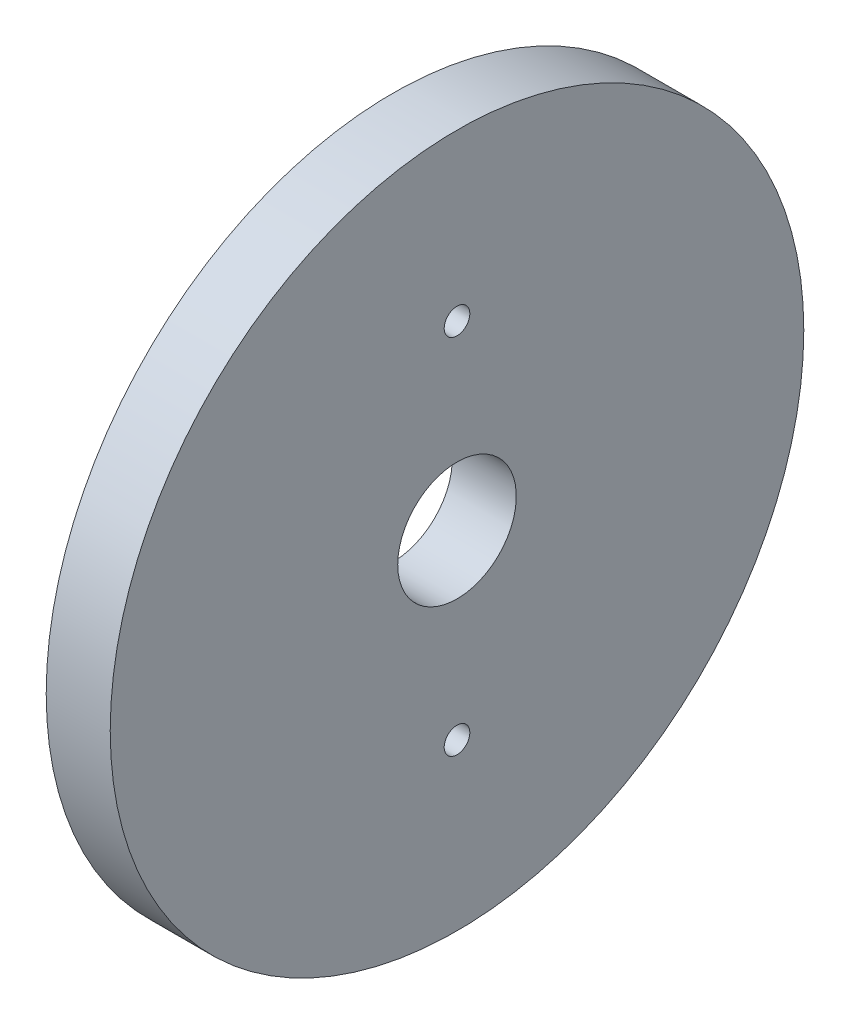
ISO-10303-21;
HEADER;
FILE_DESCRIPTION(('STEP AP214'),'2;1');
FILE_NAME('part.step','',(''),(''),'','','');
FILE_SCHEMA(('AUTOMOTIVE_DESIGN { 1 0 10303 214 1 1 1 1 }'));
ENDSEC;
DATA;
#1=APPLICATION_CONTEXT('core data for automotive mechanical design processes');
#2=APPLICATION_PROTOCOL_DEFINITION('international standard','automotive_design',2000,#1);
#3=PRODUCT_CONTEXT('',#1,'mechanical');
#4=PRODUCT('Part','Part','',(#3));
#5=PRODUCT_RELATED_PRODUCT_CATEGORY('part','',(#4));
#6=PRODUCT_DEFINITION_FORMATION('','',#4);
#7=PRODUCT_DEFINITION_CONTEXT('part definition',#1,'design');
#8=PRODUCT_DEFINITION('design','',#6,#7);
#9=PRODUCT_DEFINITION_SHAPE('','',#8);
#10=(LENGTH_UNIT() NAMED_UNIT(*) SI_UNIT(.MILLI.,.METRE.));
#11=(NAMED_UNIT(*) PLANE_ANGLE_UNIT() SI_UNIT($,.RADIAN.));
#12=(NAMED_UNIT(*) SI_UNIT($,.STERADIAN.) SOLID_ANGLE_UNIT());
#13=UNCERTAINTY_MEASURE_WITH_UNIT(LENGTH_MEASURE(1.E-05),#10,'distance_accuracy_value','');
#14=(GEOMETRIC_REPRESENTATION_CONTEXT(3) GLOBAL_UNCERTAINTY_ASSIGNED_CONTEXT((#13)) GLOBAL_UNIT_ASSIGNED_CONTEXT((#10,
#11,#12)) REPRESENTATION_CONTEXT('',''));
#15=CARTESIAN_POINT('',(0.,0.,0.));
#16=DIRECTION('',(0.,0.,1.));
#17=DIRECTION('',(1.,0.,0.));
#18=AXIS2_PLACEMENT_3D('',#15,#16,#17);
#19=CARTESIAN_POINT('',(13.7,65.,0.));
#20=DIRECTION('',(1.,0.,0.));
#21=DIRECTION('',(0.,0.,-1.));
#22=AXIS2_PLACEMENT_3D('',#19,#20,#21);
#23=PLANE('',#22);
#24=CARTESIAN_POINT('',(13.7,34.,0.));
#25=DIRECTION('',(1.,0.,0.));
#26=DIRECTION('',(0.,0.,-1.));
#27=AXIS2_PLACEMENT_3D('',#24,#25,#26);
#28=CIRCLE('',#27,2.4);
#29=CARTESIAN_POINT('',(13.7,34.,-2.4));
#30=VERTEX_POINT('',#29);
#31=EDGE_CURVE('E60',#30,#30,#28,.F.);
#32=ORIENTED_EDGE('',*,*,#31,.F.);
#33=EDGE_LOOP('',(#32));
#34=FACE_BOUND('',#33,.T.);
#35=CARTESIAN_POINT('',(13.7,-34.,0.));
#36=DIRECTION('',(1.,0.,0.));
#37=DIRECTION('',(0.,0.,-1.));
#38=AXIS2_PLACEMENT_3D('',#35,#36,#37);
#39=CIRCLE('',#38,2.4);
#40=CARTESIAN_POINT('',(13.7,-34.,-2.4));
#41=VERTEX_POINT('',#40);
#42=EDGE_CURVE('E64',#41,#41,#39,.F.);
#43=ORIENTED_EDGE('',*,*,#42,.F.);
#44=EDGE_LOOP('',(#43));
#45=FACE_BOUND('',#44,.T.);
#46=CARTESIAN_POINT('',(13.7,0.,0.));
#47=DIRECTION('',(-1.,0.,0.));
#48=DIRECTION('',(0.,0.,1.));
#49=AXIS2_PLACEMENT_3D('',#46,#47,#48);
#50=CIRCLE('',#49,11.1125);
#51=CARTESIAN_POINT('',(13.7,0.,11.1125));
#52=VERTEX_POINT('',#51);
#53=EDGE_CURVE('E10',#52,#52,#50,.T.);
#54=ORIENTED_EDGE('',*,*,#53,.F.);
#55=EDGE_LOOP('',(#54));
#56=FACE_BOUND('',#55,.T.);
#57=CARTESIAN_POINT('',(13.7,0.,0.));
#58=DIRECTION('',(-1.,0.,0.));
#59=DIRECTION('',(0.,0.,1.));
#60=AXIS2_PLACEMENT_3D('',#57,#58,#59);
#61=CIRCLE('',#60,65.);
#62=CARTESIAN_POINT('',(13.7,0.,65.));
#63=VERTEX_POINT('',#62);
#64=EDGE_CURVE('E54',#63,#63,#61,.T.);
#65=ORIENTED_EDGE('',*,*,#64,.T.);
#66=EDGE_LOOP('',(#65));
#67=FACE_BOUND('',#66,.T.);
#68=ADVANCED_FACE('F37',(#34,#45,#56,#67),#23,.F.);
#69=CARTESIAN_POINT('',(-110.,0.,0.));
#70=DIRECTION('',(-1.,0.,0.));
#71=DIRECTION('',(0.,0.,1.));
#72=AXIS2_PLACEMENT_3D('',#69,#70,#71);
#73=CYLINDRICAL_SURFACE('',#72,11.1125);
#74=CARTESIAN_POINT('',(25.7,0.,0.));
#75=DIRECTION('',(-1.,0.,0.));
#76=DIRECTION('',(0.,0.,1.));
#77=AXIS2_PLACEMENT_3D('',#74,#75,#76);
#78=CIRCLE('',#77,11.1125);
#79=CARTESIAN_POINT('',(25.7,0.,11.1125));
#80=VERTEX_POINT('',#79);
#81=EDGE_CURVE('E44',#80,#80,#78,.T.);
#82=ORIENTED_EDGE('',*,*,#81,.F.);
#83=EDGE_LOOP('',(#82));
#84=FACE_BOUND('',#83,.T.);
#85=ORIENTED_EDGE('',*,*,#53,.T.);
#86=EDGE_LOOP('',(#85));
#87=FACE_BOUND('',#86,.T.);
#88=ADVANCED_FACE('F84',(#84,#87),#73,.F.);
#89=CARTESIAN_POINT('',(25.7,11.1125,0.));
#90=DIRECTION('',(-1.,0.,0.));
#91=DIRECTION('',(0.,0.,1.));
#92=AXIS2_PLACEMENT_3D('',#89,#90,#91);
#93=PLANE('',#92);
#94=CARTESIAN_POINT('',(25.7,34.,0.));
#95=DIRECTION('',(1.,0.,0.));
#96=DIRECTION('',(0.,0.,-1.));
#97=AXIS2_PLACEMENT_3D('',#94,#95,#96);
#98=CIRCLE('',#97,2.4);
#99=CARTESIAN_POINT('',(25.7,34.,-2.4));
#100=VERTEX_POINT('',#99);
#101=EDGE_CURVE('E68',#100,#100,#98,.T.);
#102=ORIENTED_EDGE('',*,*,#101,.F.);
#103=EDGE_LOOP('',(#102));
#104=FACE_BOUND('',#103,.T.);
#105=CARTESIAN_POINT('',(25.7,-34.,0.));
#106=DIRECTION('',(1.,0.,0.));
#107=DIRECTION('',(0.,0.,-1.));
#108=AXIS2_PLACEMENT_3D('',#105,#106,#107);
#109=CIRCLE('',#108,2.4);
#110=CARTESIAN_POINT('',(25.7,-34.,-2.4));
#111=VERTEX_POINT('',#110);
#112=EDGE_CURVE('E69',#111,#111,#109,.T.);
#113=ORIENTED_EDGE('',*,*,#112,.F.);
#114=EDGE_LOOP('',(#113));
#115=FACE_BOUND('',#114,.T.);
#116=CARTESIAN_POINT('',(25.7,0.,0.));
#117=DIRECTION('',(-1.,0.,0.));
#118=DIRECTION('',(0.,0.,1.));
#119=AXIS2_PLACEMENT_3D('',#116,#117,#118);
#120=CIRCLE('',#119,65.);
#121=CARTESIAN_POINT('',(25.7,0.,65.));
#122=VERTEX_POINT('',#121);
#123=EDGE_CURVE('E49',#122,#122,#120,.T.);
#124=ORIENTED_EDGE('',*,*,#123,.F.);
#125=EDGE_LOOP('',(#124));
#126=FACE_BOUND('',#125,.T.);
#127=ORIENTED_EDGE('',*,*,#81,.T.);
#128=EDGE_LOOP('',(#127));
#129=FACE_BOUND('',#128,.T.);
#130=ADVANCED_FACE('F80',(#104,#115,#126,#129),#93,.F.);
#131=CARTESIAN_POINT('',(-110.,0.,0.));
#132=DIRECTION('',(-1.,0.,0.));
#133=DIRECTION('',(0.,0.,1.));
#134=AXIS2_PLACEMENT_3D('',#131,#132,#133);
#135=CYLINDRICAL_SURFACE('',#134,65.);
#136=ORIENTED_EDGE('',*,*,#64,.F.);
#137=EDGE_LOOP('',(#136));
#138=FACE_BOUND('',#137,.T.);
#139=ORIENTED_EDGE('',*,*,#123,.T.);
#140=EDGE_LOOP('',(#139));
#141=FACE_BOUND('',#140,.T.);
#142=ADVANCED_FACE('F83',(#138,#141),#135,.T.);
#143=CARTESIAN_POINT('',(25.7,-34.,0.));
#144=DIRECTION('',(-1.,0.,0.));
#145=DIRECTION('',(0.,0.,1.));
#146=AXIS2_PLACEMENT_3D('',#143,#144,#145);
#147=CYLINDRICAL_SURFACE('',#146,2.4);
#148=ORIENTED_EDGE('',*,*,#112,.T.);
#149=EDGE_LOOP('',(#148));
#150=FACE_BOUND('',#149,.T.);
#151=ORIENTED_EDGE('',*,*,#42,.T.);
#152=EDGE_LOOP('',(#151));
#153=FACE_BOUND('',#152,.T.);
#154=ADVANCED_FACE('F91',(#150,#153),#147,.F.);
#155=CARTESIAN_POINT('',(25.7,34.,0.));
#156=DIRECTION('',(-1.,0.,0.));
#157=DIRECTION('',(0.,0.,1.));
#158=AXIS2_PLACEMENT_3D('',#155,#156,#157);
#159=CYLINDRICAL_SURFACE('',#158,2.4);
#160=ORIENTED_EDGE('',*,*,#101,.T.);
#161=EDGE_LOOP('',(#160));
#162=FACE_BOUND('',#161,.T.);
#163=ORIENTED_EDGE('',*,*,#31,.T.);
#164=EDGE_LOOP('',(#163));
#165=FACE_BOUND('',#164,.T.);
#166=ADVANCED_FACE('F77',(#162,#165),#159,.F.);
#167=CLOSED_SHELL('',(#68,#88,#130,#142,#154,#166));
#168=MANIFOLD_SOLID_BREP('B2',#167);
#169=ADVANCED_BREP_SHAPE_REPRESENTATION('',(#18,#168),#14);
#170=SHAPE_DEFINITION_REPRESENTATION(#9,#169);
ENDSEC;
END-ISO-10303-21;
